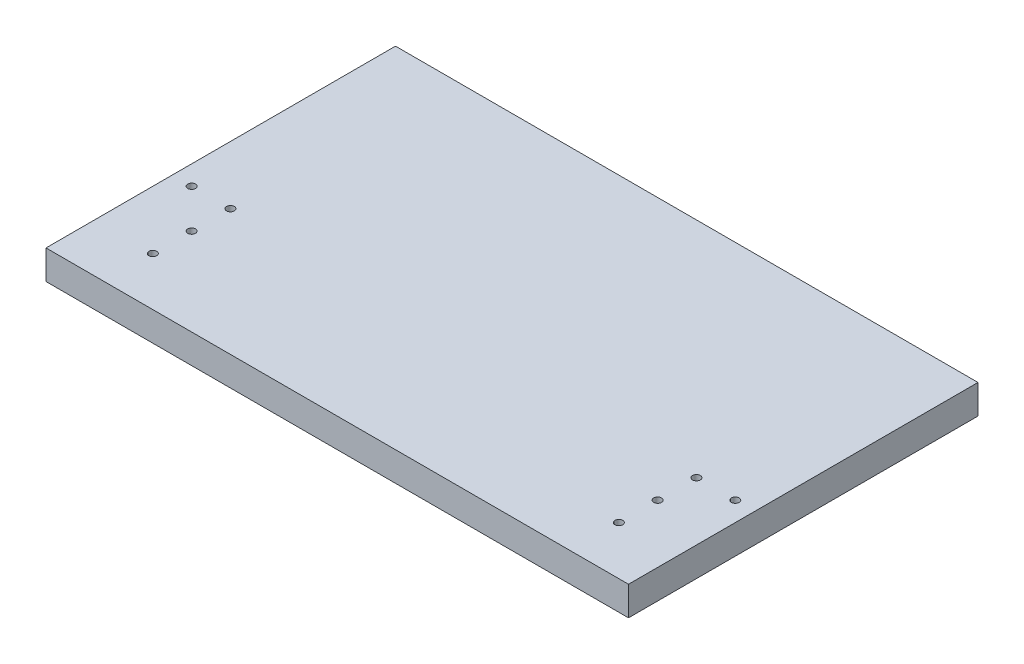
ISO-10303-21;
HEADER;
FILE_DESCRIPTION(('STEP AP214'),'2;1');
FILE_NAME('part.step','',(''),(''),'','','');
FILE_SCHEMA(('AUTOMOTIVE_DESIGN { 1 0 10303 214 1 1 1 1 }'));
ENDSEC;
DATA;
#1=APPLICATION_CONTEXT('core data for automotive mechanical design processes');
#2=APPLICATION_PROTOCOL_DEFINITION('international standard','automotive_design',2000,#1);
#3=PRODUCT_CONTEXT('',#1,'mechanical');
#4=PRODUCT('Part','Part','',(#3));
#5=PRODUCT_RELATED_PRODUCT_CATEGORY('part','',(#4));
#6=PRODUCT_DEFINITION_FORMATION('','',#4);
#7=PRODUCT_DEFINITION_CONTEXT('part definition',#1,'design');
#8=PRODUCT_DEFINITION('design','',#6,#7);
#9=PRODUCT_DEFINITION_SHAPE('','',#8);
#10=(LENGTH_UNIT() NAMED_UNIT(*) SI_UNIT(.MILLI.,.METRE.));
#11=(NAMED_UNIT(*) PLANE_ANGLE_UNIT() SI_UNIT($,.RADIAN.));
#12=(NAMED_UNIT(*) SI_UNIT($,.STERADIAN.) SOLID_ANGLE_UNIT());
#13=UNCERTAINTY_MEASURE_WITH_UNIT(LENGTH_MEASURE(1.E-05),#10,'distance_accuracy_value','');
#14=(GEOMETRIC_REPRESENTATION_CONTEXT(3) GLOBAL_UNCERTAINTY_ASSIGNED_CONTEXT((#13)) GLOBAL_UNIT_ASSIGNED_CONTEXT((#10,
#11,#12)) REPRESENTATION_CONTEXT('',''));
#15=CARTESIAN_POINT('',(0.,0.,0.));
#16=DIRECTION('',(0.,0.,1.));
#17=DIRECTION('',(1.,0.,0.));
#18=AXIS2_PLACEMENT_3D('',#15,#16,#17);
#19=CARTESIAN_POINT('',(150.,15.,90.));
#20=DIRECTION('',(-1.,0.,0.));
#21=DIRECTION('',(0.,0.,1.));
#22=AXIS2_PLACEMENT_3D('',#19,#20,#21);
#23=PLANE('',#22);
#24=DIRECTION('',(0.,0.,-1.));
#25=VECTOR('',#24,1.);
#26=CARTESIAN_POINT('',(150.,0.,90.));
#27=LINE('',#26,#25);
#28=CARTESIAN_POINT('',(150.,0.,90.));
#29=VERTEX_POINT('',#28);
#30=CARTESIAN_POINT('',(150.,0.,-90.));
#31=VERTEX_POINT('',#30);
#32=EDGE_CURVE('E96',#29,#31,#27,.T.);
#33=ORIENTED_EDGE('',*,*,#32,.T.);
#34=DIRECTION('',(0.,-1.,0.));
#35=VECTOR('',#34,1.);
#36=CARTESIAN_POINT('',(150.,15.,-90.));
#37=LINE('',#36,#35);
#38=CARTESIAN_POINT('',(150.,15.,-90.));
#39=VERTEX_POINT('',#38);
#40=EDGE_CURVE('E11',#39,#31,#37,.T.);
#41=ORIENTED_EDGE('',*,*,#40,.F.);
#42=DIRECTION('',(0.,0.,-1.));
#43=VECTOR('',#42,1.);
#44=CARTESIAN_POINT('',(150.,15.,90.));
#45=LINE('',#44,#43);
#46=CARTESIAN_POINT('',(150.,15.,90.));
#47=VERTEX_POINT('',#46);
#48=EDGE_CURVE('E84',#47,#39,#45,.T.);
#49=ORIENTED_EDGE('',*,*,#48,.F.);
#50=DIRECTION('',(0.,-1.,0.));
#51=VECTOR('',#50,1.);
#52=CARTESIAN_POINT('',(150.,15.,90.));
#53=LINE('',#52,#51);
#54=EDGE_CURVE('E92',#47,#29,#53,.T.);
#55=ORIENTED_EDGE('',*,*,#54,.T.);
#56=EDGE_LOOP('',(#33,#41,#49,#55));
#57=FACE_BOUND('',#56,.T.);
#58=ADVANCED_FACE('F33',(#57),#23,.F.);
#59=CARTESIAN_POINT('',(-150.,15.,-90.));
#60=DIRECTION('',(0.,0.,1.));
#61=DIRECTION('',(1.,0.,0.));
#62=AXIS2_PLACEMENT_3D('',#59,#60,#61);
#63=PLANE('',#62);
#64=DIRECTION('',(-1.,0.,0.));
#65=VECTOR('',#64,1.);
#66=CARTESIAN_POINT('',(-150.,0.,-90.));
#67=LINE('',#66,#65);
#68=CARTESIAN_POINT('',(-150.,0.,-90.));
#69=VERTEX_POINT('',#68);
#70=EDGE_CURVE('E88',#31,#69,#67,.T.);
#71=ORIENTED_EDGE('',*,*,#70,.T.);
#72=DIRECTION('',(0.,-1.,0.));
#73=VECTOR('',#72,1.);
#74=CARTESIAN_POINT('',(-150.,15.,-90.));
#75=LINE('',#74,#73);
#76=CARTESIAN_POINT('',(-150.,15.,-90.));
#77=VERTEX_POINT('',#76);
#78=EDGE_CURVE('E41',#77,#69,#75,.T.);
#79=ORIENTED_EDGE('',*,*,#78,.F.);
#80=DIRECTION('',(-1.,0.,0.));
#81=VECTOR('',#80,1.);
#82=CARTESIAN_POINT('',(-150.,15.,-90.));
#83=LINE('',#82,#81);
#84=EDGE_CURVE('E79',#39,#77,#83,.T.);
#85=ORIENTED_EDGE('',*,*,#84,.F.);
#86=ORIENTED_EDGE('',*,*,#40,.T.);
#87=EDGE_LOOP('',(#71,#79,#85,#86));
#88=FACE_BOUND('',#87,.T.);
#89=ADVANCED_FACE('F87',(#88),#63,.F.);
#90=CARTESIAN_POINT('',(-150.,15.,90.));
#91=DIRECTION('',(1.,0.,0.));
#92=DIRECTION('',(0.,0.,-1.));
#93=AXIS2_PLACEMENT_3D('',#90,#91,#92);
#94=PLANE('',#93);
#95=DIRECTION('',(0.,0.,1.));
#96=VECTOR('',#95,1.);
#97=CARTESIAN_POINT('',(-150.,0.,90.));
#98=LINE('',#97,#96);
#99=CARTESIAN_POINT('',(-150.,0.,90.));
#100=VERTEX_POINT('',#99);
#101=EDGE_CURVE('E66',#69,#100,#98,.T.);
#102=ORIENTED_EDGE('',*,*,#101,.T.);
#103=DIRECTION('',(0.,-1.,0.));
#104=VECTOR('',#103,1.);
#105=CARTESIAN_POINT('',(-150.,15.,90.));
#106=LINE('',#105,#104);
#107=CARTESIAN_POINT('',(-150.,15.,90.));
#108=VERTEX_POINT('',#107);
#109=EDGE_CURVE('E89',#108,#100,#106,.T.);
#110=ORIENTED_EDGE('',*,*,#109,.F.);
#111=DIRECTION('',(0.,0.,1.));
#112=VECTOR('',#111,1.);
#113=CARTESIAN_POINT('',(-150.,15.,90.));
#114=LINE('',#113,#112);
#115=EDGE_CURVE('E82',#77,#108,#114,.T.);
#116=ORIENTED_EDGE('',*,*,#115,.F.);
#117=ORIENTED_EDGE('',*,*,#78,.T.);
#118=EDGE_LOOP('',(#102,#110,#116,#117));
#119=FACE_BOUND('',#118,.T.);
#120=ADVANCED_FACE('F90',(#119),#94,.F.);
#121=CARTESIAN_POINT('',(-150.,15.,90.));
#122=DIRECTION('',(0.,0.,-1.));
#123=DIRECTION('',(-1.,0.,0.));
#124=AXIS2_PLACEMENT_3D('',#121,#122,#123);
#125=PLANE('',#124);
#126=DIRECTION('',(1.,0.,0.));
#127=VECTOR('',#126,1.);
#128=CARTESIAN_POINT('',(-150.,0.,90.));
#129=LINE('',#128,#127);
#130=EDGE_CURVE('E72',#100,#29,#129,.T.);
#131=ORIENTED_EDGE('',*,*,#130,.T.);
#132=ORIENTED_EDGE('',*,*,#54,.F.);
#133=DIRECTION('',(1.,0.,0.));
#134=VECTOR('',#133,1.);
#135=CARTESIAN_POINT('',(-150.,15.,90.));
#136=LINE('',#135,#134);
#137=EDGE_CURVE('E49',#108,#47,#136,.T.);
#138=ORIENTED_EDGE('',*,*,#137,.F.);
#139=ORIENTED_EDGE('',*,*,#109,.T.);
#140=EDGE_LOOP('',(#131,#132,#138,#139));
#141=FACE_BOUND('',#140,.T.);
#142=ADVANCED_FACE('F104',(#141),#125,.F.);
#143=CARTESIAN_POINT('',(0.,15.,0.));
#144=DIRECTION('',(0.,-1.,0.));
#145=DIRECTION('',(0.,0.,-1.));
#146=AXIS2_PLACEMENT_3D('',#143,#144,#145);
#147=PLANE('',#146);
#148=CARTESIAN_POINT('',(140.,15.,25.));
#149=DIRECTION('',(0.,1.,0.));
#150=DIRECTION('',(0.,0.,1.));
#151=AXIS2_PLACEMENT_3D('',#148,#149,#150);
#152=CIRCLE('',#151,2.);
#153=CARTESIAN_POINT('',(140.,15.,27.));
#154=VERTEX_POINT('',#153);
#155=EDGE_CURVE('E152',#154,#154,#152,.T.);
#156=ORIENTED_EDGE('',*,*,#155,.F.);
#157=EDGE_LOOP('',(#156));
#158=FACE_BOUND('',#157,.T.);
#159=CARTESIAN_POINT('',(120.,15.,25.));
#160=DIRECTION('',(0.,1.,0.));
#161=DIRECTION('',(0.,0.,1.));
#162=AXIS2_PLACEMENT_3D('',#159,#160,#161);
#163=CIRCLE('',#162,2.);
#164=CARTESIAN_POINT('',(120.,15.,27.));
#165=VERTEX_POINT('',#164);
#166=EDGE_CURVE('E146',#165,#165,#163,.T.);
#167=ORIENTED_EDGE('',*,*,#166,.F.);
#168=EDGE_LOOP('',(#167));
#169=FACE_BOUND('',#168,.T.);
#170=CARTESIAN_POINT('',(-120.,15.,25.));
#171=DIRECTION('',(0.,1.,0.));
#172=DIRECTION('',(0.,0.,1.));
#173=AXIS2_PLACEMENT_3D('',#170,#171,#172);
#174=CIRCLE('',#173,2.);
#175=CARTESIAN_POINT('',(-120.,15.,27.));
#176=VERTEX_POINT('',#175);
#177=EDGE_CURVE('E140',#176,#176,#174,.T.);
#178=ORIENTED_EDGE('',*,*,#177,.F.);
#179=EDGE_LOOP('',(#178));
#180=FACE_BOUND('',#179,.T.);
#181=CARTESIAN_POINT('',(-140.,15.,25.));
#182=DIRECTION('',(0.,1.,0.));
#183=DIRECTION('',(0.,0.,1.));
#184=AXIS2_PLACEMENT_3D('',#181,#182,#183);
#185=CIRCLE('',#184,2.);
#186=CARTESIAN_POINT('',(-140.,15.,27.));
#187=VERTEX_POINT('',#186);
#188=EDGE_CURVE('E134',#187,#187,#185,.T.);
#189=ORIENTED_EDGE('',*,*,#188,.F.);
#190=EDGE_LOOP('',(#189));
#191=FACE_BOUND('',#190,.T.);
#192=CARTESIAN_POINT('',(120.,15.,45.));
#193=DIRECTION('',(0.,1.,0.));
#194=DIRECTION('',(0.,0.,1.));
#195=AXIS2_PLACEMENT_3D('',#192,#193,#194);
#196=CIRCLE('',#195,2.);
#197=CARTESIAN_POINT('',(120.,15.,47.));
#198=VERTEX_POINT('',#197);
#199=EDGE_CURVE('E128',#198,#198,#196,.T.);
#200=ORIENTED_EDGE('',*,*,#199,.F.);
#201=EDGE_LOOP('',(#200));
#202=FACE_BOUND('',#201,.T.);
#203=CARTESIAN_POINT('',(120.,15.,65.));
#204=DIRECTION('',(0.,1.,0.));
#205=DIRECTION('',(0.,0.,1.));
#206=AXIS2_PLACEMENT_3D('',#203,#204,#205);
#207=CIRCLE('',#206,2.);
#208=CARTESIAN_POINT('',(120.,15.,67.));
#209=VERTEX_POINT('',#208);
#210=EDGE_CURVE('E122',#209,#209,#207,.T.);
#211=ORIENTED_EDGE('',*,*,#210,.F.);
#212=EDGE_LOOP('',(#211));
#213=FACE_BOUND('',#212,.T.);
#214=CARTESIAN_POINT('',(-120.,15.,45.));
#215=DIRECTION('',(0.,1.,0.));
#216=DIRECTION('',(0.,0.,1.));
#217=AXIS2_PLACEMENT_3D('',#214,#215,#216);
#218=CIRCLE('',#217,2.);
#219=CARTESIAN_POINT('',(-120.,15.,47.));
#220=VERTEX_POINT('',#219);
#221=EDGE_CURVE('E116',#220,#220,#218,.T.);
#222=ORIENTED_EDGE('',*,*,#221,.F.);
#223=EDGE_LOOP('',(#222));
#224=FACE_BOUND('',#223,.T.);
#225=CARTESIAN_POINT('',(-120.,15.,65.));
#226=DIRECTION('',(0.,1.,0.));
#227=DIRECTION('',(0.,0.,1.));
#228=AXIS2_PLACEMENT_3D('',#225,#226,#227);
#229=CIRCLE('',#228,2.);
#230=CARTESIAN_POINT('',(-120.,15.,67.));
#231=VERTEX_POINT('',#230);
#232=EDGE_CURVE('E110',#231,#231,#229,.T.);
#233=ORIENTED_EDGE('',*,*,#232,.F.);
#234=EDGE_LOOP('',(#233));
#235=FACE_BOUND('',#234,.T.);
#236=ORIENTED_EDGE('',*,*,#48,.T.);
#237=ORIENTED_EDGE('',*,*,#84,.T.);
#238=ORIENTED_EDGE('',*,*,#115,.T.);
#239=ORIENTED_EDGE('',*,*,#137,.T.);
#240=EDGE_LOOP('',(#236,#237,#238,#239));
#241=FACE_BOUND('',#240,.T.);
#242=ADVANCED_FACE('F80',(#158,#169,#180,#191,#202,#213,#224,#235,#241),#147,.F.);
#243=CARTESIAN_POINT('',(0.,0.,0.));
#244=DIRECTION('',(0.,-1.,0.));
#245=DIRECTION('',(0.,0.,-1.));
#246=AXIS2_PLACEMENT_3D('',#243,#244,#245);
#247=PLANE('',#246);
#248=CARTESIAN_POINT('',(140.,0.,-65.));
#249=DIRECTION('',(0.,-1.,0.));
#250=DIRECTION('',(0.,0.,-1.));
#251=AXIS2_PLACEMENT_3D('',#248,#249,#250);
#252=CIRCLE('',#251,2.);
#253=CARTESIAN_POINT('',(140.,0.,-67.));
#254=VERTEX_POINT('',#253);
#255=EDGE_CURVE('E158',#254,#254,#252,.T.);
#256=ORIENTED_EDGE('',*,*,#255,.F.);
#257=EDGE_LOOP('',(#256));
#258=FACE_BOUND('',#257,.T.);
#259=ORIENTED_EDGE('',*,*,#32,.F.);
#260=ORIENTED_EDGE('',*,*,#130,.F.);
#261=ORIENTED_EDGE('',*,*,#101,.F.);
#262=ORIENTED_EDGE('',*,*,#70,.F.);
#263=EDGE_LOOP('',(#259,#260,#261,#262));
#264=FACE_BOUND('',#263,.T.);
#265=ADVANCED_FACE('F107',(#258,#264),#247,.T.);
#266=CARTESIAN_POINT('',(-120.,5.,65.));
#267=DIRECTION('',(0.,1.,0.));
#268=DIRECTION('',(0.,0.,1.));
#269=AXIS2_PLACEMENT_3D('',#266,#267,#268);
#270=CYLINDRICAL_SURFACE('',#269,2.);
#271=CARTESIAN_POINT('',(-120.,5.,65.));
#272=DIRECTION('',(0.,1.,0.));
#273=DIRECTION('',(0.,0.,1.));
#274=AXIS2_PLACEMENT_3D('',#271,#272,#273);
#275=CIRCLE('',#274,2.);
#276=CARTESIAN_POINT('',(-120.,5.,67.));
#277=VERTEX_POINT('',#276);
#278=EDGE_CURVE('E99',#277,#277,#275,.T.);
#279=ORIENTED_EDGE('',*,*,#278,.F.);
#280=EDGE_LOOP('',(#279));
#281=FACE_BOUND('',#280,.T.);
#282=ORIENTED_EDGE('',*,*,#232,.T.);
#283=EDGE_LOOP('',(#282));
#284=FACE_BOUND('',#283,.T.);
#285=ADVANCED_FACE('F174',(#281,#284),#270,.F.);
#286=CARTESIAN_POINT('',(-120.,5.,65.));
#287=DIRECTION('',(0.,1.,0.));
#288=DIRECTION('',(0.,0.,1.));
#289=AXIS2_PLACEMENT_3D('',#286,#287,#288);
#290=PLANE('',#289);
#291=ORIENTED_EDGE('',*,*,#278,.T.);
#292=EDGE_LOOP('',(#291));
#293=FACE_BOUND('',#292,.T.);
#294=ADVANCED_FACE('F181',(#293),#290,.T.);
#295=CARTESIAN_POINT('',(-120.,5.,45.));
#296=DIRECTION('',(0.,1.,0.));
#297=DIRECTION('',(0.,0.,1.));
#298=AXIS2_PLACEMENT_3D('',#295,#296,#297);
#299=CYLINDRICAL_SURFACE('',#298,2.);
#300=CARTESIAN_POINT('',(-120.,5.,45.));
#301=DIRECTION('',(0.,1.,0.));
#302=DIRECTION('',(0.,0.,1.));
#303=AXIS2_PLACEMENT_3D('',#300,#301,#302);
#304=CIRCLE('',#303,2.);
#305=CARTESIAN_POINT('',(-120.,5.,47.));
#306=VERTEX_POINT('',#305);
#307=EDGE_CURVE('E113',#306,#306,#304,.T.);
#308=ORIENTED_EDGE('',*,*,#307,.F.);
#309=EDGE_LOOP('',(#308));
#310=FACE_BOUND('',#309,.T.);
#311=ORIENTED_EDGE('',*,*,#221,.T.);
#312=EDGE_LOOP('',(#311));
#313=FACE_BOUND('',#312,.T.);
#314=ADVANCED_FACE('F219',(#310,#313),#299,.F.);
#315=CARTESIAN_POINT('',(-120.,5.,45.));
#316=DIRECTION('',(0.,1.,0.));
#317=DIRECTION('',(0.,0.,1.));
#318=AXIS2_PLACEMENT_3D('',#315,#316,#317);
#319=PLANE('',#318);
#320=ORIENTED_EDGE('',*,*,#307,.T.);
#321=EDGE_LOOP('',(#320));
#322=FACE_BOUND('',#321,.T.);
#323=ADVANCED_FACE('F227',(#322),#319,.T.);
#324=CARTESIAN_POINT('',(120.,5.,65.));
#325=DIRECTION('',(0.,1.,0.));
#326=DIRECTION('',(0.,0.,1.));
#327=AXIS2_PLACEMENT_3D('',#324,#325,#326);
#328=CYLINDRICAL_SURFACE('',#327,2.);
#329=CARTESIAN_POINT('',(120.,5.,65.));
#330=DIRECTION('',(0.,1.,0.));
#331=DIRECTION('',(0.,0.,1.));
#332=AXIS2_PLACEMENT_3D('',#329,#330,#331);
#333=CIRCLE('',#332,2.);
#334=CARTESIAN_POINT('',(120.,5.,67.));
#335=VERTEX_POINT('',#334);
#336=EDGE_CURVE('E119',#335,#335,#333,.T.);
#337=ORIENTED_EDGE('',*,*,#336,.F.);
#338=EDGE_LOOP('',(#337));
#339=FACE_BOUND('',#338,.T.);
#340=ORIENTED_EDGE('',*,*,#210,.T.);
#341=EDGE_LOOP('',(#340));
#342=FACE_BOUND('',#341,.T.);
#343=ADVANCED_FACE('F235',(#339,#342),#328,.F.);
#344=CARTESIAN_POINT('',(120.,5.,65.));
#345=DIRECTION('',(0.,1.,0.));
#346=DIRECTION('',(0.,0.,1.));
#347=AXIS2_PLACEMENT_3D('',#344,#345,#346);
#348=PLANE('',#347);
#349=ORIENTED_EDGE('',*,*,#336,.T.);
#350=EDGE_LOOP('',(#349));
#351=FACE_BOUND('',#350,.T.);
#352=ADVANCED_FACE('F243',(#351),#348,.T.);
#353=CARTESIAN_POINT('',(120.,5.,45.));
#354=DIRECTION('',(0.,1.,0.));
#355=DIRECTION('',(0.,0.,1.));
#356=AXIS2_PLACEMENT_3D('',#353,#354,#355);
#357=CYLINDRICAL_SURFACE('',#356,2.);
#358=CARTESIAN_POINT('',(120.,5.,45.));
#359=DIRECTION('',(0.,1.,0.));
#360=DIRECTION('',(0.,0.,1.));
#361=AXIS2_PLACEMENT_3D('',#358,#359,#360);
#362=CIRCLE('',#361,2.);
#363=CARTESIAN_POINT('',(120.,5.,47.));
#364=VERTEX_POINT('',#363);
#365=EDGE_CURVE('E125',#364,#364,#362,.T.);
#366=ORIENTED_EDGE('',*,*,#365,.F.);
#367=EDGE_LOOP('',(#366));
#368=FACE_BOUND('',#367,.T.);
#369=ORIENTED_EDGE('',*,*,#199,.T.);
#370=EDGE_LOOP('',(#369));
#371=FACE_BOUND('',#370,.T.);
#372=ADVANCED_FACE('F251',(#368,#371),#357,.F.);
#373=CARTESIAN_POINT('',(120.,5.,45.));
#374=DIRECTION('',(0.,1.,0.));
#375=DIRECTION('',(0.,0.,1.));
#376=AXIS2_PLACEMENT_3D('',#373,#374,#375);
#377=PLANE('',#376);
#378=ORIENTED_EDGE('',*,*,#365,.T.);
#379=EDGE_LOOP('',(#378));
#380=FACE_BOUND('',#379,.T.);
#381=ADVANCED_FACE('F259',(#380),#377,.T.);
#382=CARTESIAN_POINT('',(-140.,5.,25.));
#383=DIRECTION('',(0.,1.,0.));
#384=DIRECTION('',(0.,0.,1.));
#385=AXIS2_PLACEMENT_3D('',#382,#383,#384);
#386=CYLINDRICAL_SURFACE('',#385,2.);
#387=CARTESIAN_POINT('',(-140.,5.,25.));
#388=DIRECTION('',(0.,1.,0.));
#389=DIRECTION('',(0.,0.,1.));
#390=AXIS2_PLACEMENT_3D('',#387,#388,#389);
#391=CIRCLE('',#390,2.);
#392=CARTESIAN_POINT('',(-140.,5.,27.));
#393=VERTEX_POINT('',#392);
#394=EDGE_CURVE('E131',#393,#393,#391,.T.);
#395=ORIENTED_EDGE('',*,*,#394,.F.);
#396=EDGE_LOOP('',(#395));
#397=FACE_BOUND('',#396,.T.);
#398=ORIENTED_EDGE('',*,*,#188,.T.);
#399=EDGE_LOOP('',(#398));
#400=FACE_BOUND('',#399,.T.);
#401=ADVANCED_FACE('F267',(#397,#400),#386,.F.);
#402=CARTESIAN_POINT('',(-140.,5.,25.));
#403=DIRECTION('',(0.,1.,0.));
#404=DIRECTION('',(0.,0.,1.));
#405=AXIS2_PLACEMENT_3D('',#402,#403,#404);
#406=PLANE('',#405);
#407=ORIENTED_EDGE('',*,*,#394,.T.);
#408=EDGE_LOOP('',(#407));
#409=FACE_BOUND('',#408,.T.);
#410=ADVANCED_FACE('F275',(#409),#406,.T.);
#411=CARTESIAN_POINT('',(-120.,5.,25.));
#412=DIRECTION('',(0.,1.,0.));
#413=DIRECTION('',(0.,0.,1.));
#414=AXIS2_PLACEMENT_3D('',#411,#412,#413);
#415=CYLINDRICAL_SURFACE('',#414,2.);
#416=CARTESIAN_POINT('',(-120.,5.,25.));
#417=DIRECTION('',(0.,1.,0.));
#418=DIRECTION('',(0.,0.,1.));
#419=AXIS2_PLACEMENT_3D('',#416,#417,#418);
#420=CIRCLE('',#419,2.);
#421=CARTESIAN_POINT('',(-120.,5.,27.));
#422=VERTEX_POINT('',#421);
#423=EDGE_CURVE('E137',#422,#422,#420,.T.);
#424=ORIENTED_EDGE('',*,*,#423,.F.);
#425=EDGE_LOOP('',(#424));
#426=FACE_BOUND('',#425,.T.);
#427=ORIENTED_EDGE('',*,*,#177,.T.);
#428=EDGE_LOOP('',(#427));
#429=FACE_BOUND('',#428,.T.);
#430=ADVANCED_FACE('F283',(#426,#429),#415,.F.);
#431=CARTESIAN_POINT('',(-120.,5.,25.));
#432=DIRECTION('',(0.,1.,0.));
#433=DIRECTION('',(0.,0.,1.));
#434=AXIS2_PLACEMENT_3D('',#431,#432,#433);
#435=PLANE('',#434);
#436=ORIENTED_EDGE('',*,*,#423,.T.);
#437=EDGE_LOOP('',(#436));
#438=FACE_BOUND('',#437,.T.);
#439=ADVANCED_FACE('F291',(#438),#435,.T.);
#440=CARTESIAN_POINT('',(120.,5.,25.));
#441=DIRECTION('',(0.,1.,0.));
#442=DIRECTION('',(0.,0.,1.));
#443=AXIS2_PLACEMENT_3D('',#440,#441,#442);
#444=CYLINDRICAL_SURFACE('',#443,2.);
#445=CARTESIAN_POINT('',(120.,5.,25.));
#446=DIRECTION('',(0.,1.,0.));
#447=DIRECTION('',(0.,0.,1.));
#448=AXIS2_PLACEMENT_3D('',#445,#446,#447);
#449=CIRCLE('',#448,2.);
#450=CARTESIAN_POINT('',(120.,5.,27.));
#451=VERTEX_POINT('',#450);
#452=EDGE_CURVE('E143',#451,#451,#449,.T.);
#453=ORIENTED_EDGE('',*,*,#452,.F.);
#454=EDGE_LOOP('',(#453));
#455=FACE_BOUND('',#454,.T.);
#456=ORIENTED_EDGE('',*,*,#166,.T.);
#457=EDGE_LOOP('',(#456));
#458=FACE_BOUND('',#457,.T.);
#459=ADVANCED_FACE('F299',(#455,#458),#444,.F.);
#460=CARTESIAN_POINT('',(120.,5.,25.));
#461=DIRECTION('',(0.,1.,0.));
#462=DIRECTION('',(0.,0.,1.));
#463=AXIS2_PLACEMENT_3D('',#460,#461,#462);
#464=PLANE('',#463);
#465=ORIENTED_EDGE('',*,*,#452,.T.);
#466=EDGE_LOOP('',(#465));
#467=FACE_BOUND('',#466,.T.);
#468=ADVANCED_FACE('F307',(#467),#464,.T.);
#469=CARTESIAN_POINT('',(140.,5.,25.));
#470=DIRECTION('',(0.,1.,0.));
#471=DIRECTION('',(0.,0.,1.));
#472=AXIS2_PLACEMENT_3D('',#469,#470,#471);
#473=CYLINDRICAL_SURFACE('',#472,2.);
#474=CARTESIAN_POINT('',(140.,5.,25.));
#475=DIRECTION('',(0.,1.,0.));
#476=DIRECTION('',(0.,0.,1.));
#477=AXIS2_PLACEMENT_3D('',#474,#475,#476);
#478=CIRCLE('',#477,2.);
#479=CARTESIAN_POINT('',(140.,5.,27.));
#480=VERTEX_POINT('',#479);
#481=EDGE_CURVE('E149',#480,#480,#478,.T.);
#482=ORIENTED_EDGE('',*,*,#481,.F.);
#483=EDGE_LOOP('',(#482));
#484=FACE_BOUND('',#483,.T.);
#485=ORIENTED_EDGE('',*,*,#155,.T.);
#486=EDGE_LOOP('',(#485));
#487=FACE_BOUND('',#486,.T.);
#488=ADVANCED_FACE('F315',(#484,#487),#473,.F.);
#489=CARTESIAN_POINT('',(140.,5.,25.));
#490=DIRECTION('',(0.,1.,0.));
#491=DIRECTION('',(0.,0.,1.));
#492=AXIS2_PLACEMENT_3D('',#489,#490,#491);
#493=PLANE('',#492);
#494=ORIENTED_EDGE('',*,*,#481,.T.);
#495=EDGE_LOOP('',(#494));
#496=FACE_BOUND('',#495,.T.);
#497=ADVANCED_FACE('F169',(#496),#493,.T.);
#498=CARTESIAN_POINT('',(140.,10.,-65.));
#499=DIRECTION('',(0.,-1.,0.));
#500=DIRECTION('',(0.,0.,-1.));
#501=AXIS2_PLACEMENT_3D('',#498,#499,#500);
#502=CYLINDRICAL_SURFACE('',#501,2.);
#503=CARTESIAN_POINT('',(140.,10.,-65.));
#504=DIRECTION('',(0.,-1.,0.));
#505=DIRECTION('',(0.,0.,-1.));
#506=AXIS2_PLACEMENT_3D('',#503,#504,#505);
#507=CIRCLE('',#506,2.);
#508=CARTESIAN_POINT('',(140.,10.,-67.));
#509=VERTEX_POINT('',#508);
#510=EDGE_CURVE('E155',#509,#509,#507,.T.);
#511=ORIENTED_EDGE('',*,*,#510,.F.);
#512=EDGE_LOOP('',(#511));
#513=FACE_BOUND('',#512,.T.);
#514=ORIENTED_EDGE('',*,*,#255,.T.);
#515=EDGE_LOOP('',(#514));
#516=FACE_BOUND('',#515,.T.);
#517=ADVANCED_FACE('F166',(#513,#516),#502,.F.);
#518=CARTESIAN_POINT('',(140.,10.,-65.));
#519=DIRECTION('',(0.,-1.,0.));
#520=DIRECTION('',(0.,0.,-1.));
#521=AXIS2_PLACEMENT_3D('',#518,#519,#520);
#522=PLANE('',#521);
#523=ORIENTED_EDGE('',*,*,#510,.T.);
#524=EDGE_LOOP('',(#523));
#525=FACE_BOUND('',#524,.T.);
#526=ADVANCED_FACE('F164',(#525),#522,.T.);
#527=CLOSED_SHELL('',(#58,#89,#120,#142,#242,#265,#285,#294,#314,#323,#343,#352,#372,#381,#401,
#410,#430,#439,#459,#468,#488,#497,#517,#526));
#528=MANIFOLD_SOLID_BREP('B2',#527);
#529=ADVANCED_BREP_SHAPE_REPRESENTATION('',(#18,#528),#14);
#530=SHAPE_DEFINITION_REPRESENTATION(#9,#529);
ENDSEC;
END-ISO-10303-21;
